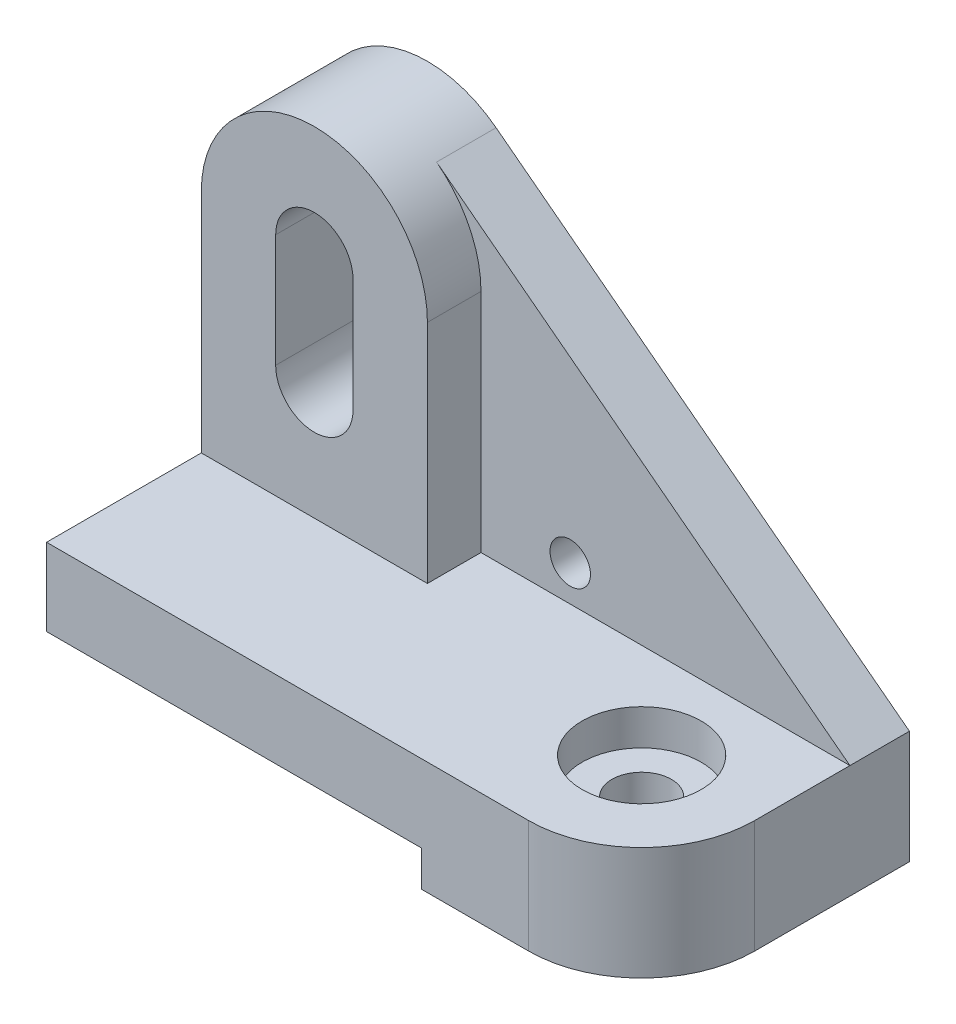
ISO-10303-21;
HEADER;
FILE_DESCRIPTION(('STEP AP214'),'2;1');
FILE_NAME('part.step','',(''),(''),'','','');
FILE_SCHEMA(('AUTOMOTIVE_DESIGN { 1 0 10303 214 1 1 1 1 }'));
ENDSEC;
DATA;
#1=APPLICATION_CONTEXT('core data for automotive mechanical design processes');
#2=APPLICATION_PROTOCOL_DEFINITION('international standard','automotive_design',2000,#1);
#3=PRODUCT_CONTEXT('',#1,'mechanical');
#4=PRODUCT('Part','Part','',(#3));
#5=PRODUCT_RELATED_PRODUCT_CATEGORY('part','',(#4));
#6=PRODUCT_DEFINITION_FORMATION('','',#4);
#7=PRODUCT_DEFINITION_CONTEXT('part definition',#1,'design');
#8=PRODUCT_DEFINITION('design','',#6,#7);
#9=PRODUCT_DEFINITION_SHAPE('','',#8);
#10=(LENGTH_UNIT() NAMED_UNIT(*) SI_UNIT(.MILLI.,.METRE.));
#11=(NAMED_UNIT(*) PLANE_ANGLE_UNIT() SI_UNIT($,.RADIAN.));
#12=(NAMED_UNIT(*) SI_UNIT($,.STERADIAN.) SOLID_ANGLE_UNIT());
#13=UNCERTAINTY_MEASURE_WITH_UNIT(LENGTH_MEASURE(1.E-05),#10,'distance_accuracy_value','');
#14=(GEOMETRIC_REPRESENTATION_CONTEXT(3) GLOBAL_UNCERTAINTY_ASSIGNED_CONTEXT((#13)) GLOBAL_UNIT_ASSIGNED_CONTEXT((#10,
#11,#12)) REPRESENTATION_CONTEXT('',''));
#15=CARTESIAN_POINT('',(0.,0.,0.));
#16=DIRECTION('',(0.,0.,1.));
#17=DIRECTION('',(1.,0.,0.));
#18=AXIS2_PLACEMENT_3D('',#15,#16,#17);
#19=CARTESIAN_POINT('',(100.,0.,45.));
#20=DIRECTION('',(0.,-1.,0.));
#21=DIRECTION('',(1.,0.,0.));
#22=AXIS2_PLACEMENT_3D('',#19,#20,#21);
#23=PLANE('',#22);
#24=CARTESIAN_POINT('',(81.,0.,26.));
#25=DIRECTION('',(0.,1.,0.));
#26=DIRECTION('',(0.,0.,1.));
#27=AXIS2_PLACEMENT_3D('',#24,#25,#26);
#28=CIRCLE('',#27,10.);
#29=CARTESIAN_POINT('',(81.,0.,36.));
#30=VERTEX_POINT('',#29);
#31=EDGE_CURVE('E353',#30,#30,#28,.T.);
#32=ORIENTED_EDGE('',*,*,#31,.F.);
#33=EDGE_LOOP('',(#32));
#34=FACE_BOUND('',#33,.T.);
#35=DIRECTION('',(-1.,0.,0.));
#36=VECTOR('',#35,1.);
#37=CARTESIAN_POINT('',(100.,0.,45.));
#38=LINE('',#37,#36);
#39=CARTESIAN_POINT('',(81.,0.,45.));
#40=VERTEX_POINT('',#39);
#41=CARTESIAN_POINT('',(0.,0.,45.));
#42=VERTEX_POINT('',#41);
#43=EDGE_CURVE('E278',#40,#42,#38,.T.);
#44=ORIENTED_EDGE('',*,*,#43,.F.);
#45=CARTESIAN_POINT('',(81.,0.,26.));
#46=DIRECTION('',(0.,-1.,0.));
#47=DIRECTION('',(1.,0.,0.));
#48=AXIS2_PLACEMENT_3D('',#45,#46,#47);
#49=CIRCLE('',#48,19.);
#50=CARTESIAN_POINT('',(100.,0.,26.));
#51=VERTEX_POINT('',#50);
#52=EDGE_CURVE('E69',#40,#51,#49,.F.);
#53=ORIENTED_EDGE('',*,*,#52,.T.);
#54=DIRECTION('',(0.,0.,-1.));
#55=VECTOR('',#54,1.);
#56=CARTESIAN_POINT('',(100.,0.,45.));
#57=LINE('',#56,#55);
#58=CARTESIAN_POINT('',(100.,0.,10.));
#59=VERTEX_POINT('',#58);
#60=EDGE_CURVE('E244',#51,#59,#57,.T.);
#61=ORIENTED_EDGE('',*,*,#60,.T.);
#62=DIRECTION('',(-1.,0.,0.));
#63=VECTOR('',#62,1.);
#64=CARTESIAN_POINT('',(0.,0.,10.));
#65=LINE('',#64,#63);
#66=CARTESIAN_POINT('',(38.,0.,10.));
#67=VERTEX_POINT('',#66);
#68=EDGE_CURVE('E215',#59,#67,#65,.T.);
#69=ORIENTED_EDGE('',*,*,#68,.T.);
#70=DIRECTION('',(0.,0.,-1.));
#71=VECTOR('',#70,1.);
#72=CARTESIAN_POINT('',(38.,0.,19.));
#73=LINE('',#72,#71);
#74=CARTESIAN_POINT('',(38.,0.,19.));
#75=VERTEX_POINT('',#74);
#76=EDGE_CURVE('E208',#75,#67,#73,.T.);
#77=ORIENTED_EDGE('',*,*,#76,.F.);
#78=DIRECTION('',(1.,0.,0.));
#79=VECTOR('',#78,1.);
#80=CARTESIAN_POINT('',(0.,0.,19.));
#81=LINE('',#80,#79);
#82=CARTESIAN_POINT('',(0.,0.,19.));
#83=VERTEX_POINT('',#82);
#84=EDGE_CURVE('E190',#83,#75,#81,.T.);
#85=ORIENTED_EDGE('',*,*,#84,.F.);
#86=DIRECTION('',(0.,0.,-1.));
#87=VECTOR('',#86,1.);
#88=CARTESIAN_POINT('',(0.,0.,45.));
#89=LINE('',#88,#87);
#90=EDGE_CURVE('E221',#42,#83,#89,.T.);
#91=ORIENTED_EDGE('',*,*,#90,.F.);
#92=EDGE_LOOP('',(#44,#53,#61,#69,#77,#85,#91));
#93=FACE_BOUND('',#92,.T.);
#94=ADVANCED_FACE('F46',(#34,#93),#23,.F.);
#95=CARTESIAN_POINT('',(19.,38.,10.));
#96=DIRECTION('',(0.,0.,-1.));
#97=DIRECTION('',(-1.,0.,0.));
#98=AXIS2_PLACEMENT_3D('',#95,#96,#97);
#99=PLANE('',#98);
#100=CARTESIAN_POINT('',(53.,6.00000000000002,10.));
#101=DIRECTION('',(0.,0.,1.));
#102=DIRECTION('',(1.,0.,0.));
#103=AXIS2_PLACEMENT_3D('',#100,#101,#102);
#104=CIRCLE('',#103,3.39999999999999);
#105=CARTESIAN_POINT('',(56.4,6.00000000000002,10.));
#106=VERTEX_POINT('',#105);
#107=EDGE_CURVE('E361',#106,#106,#104,.T.);
#108=ORIENTED_EDGE('',*,*,#107,.F.);
#109=EDGE_LOOP('',(#108));
#110=FACE_BOUND('',#109,.T.);
#111=DIRECTION('',(0.,1.,0.));
#112=VECTOR('',#111,1.);
#113=CARTESIAN_POINT('',(38.,0.,10.));
#114=LINE('',#113,#112);
#115=CARTESIAN_POINT('',(38.,38.,10.));
#116=VERTEX_POINT('',#115);
#117=EDGE_CURVE('E202',#67,#116,#114,.T.);
#118=ORIENTED_EDGE('',*,*,#117,.F.);
#119=ORIENTED_EDGE('',*,*,#68,.F.);
#120=DIRECTION('',(0.79448191507605,-0.607287812010987,0.));
#121=VECTOR('',#120,1.);
#122=CARTESIAN_POINT('',(100.,0.,10.));
#123=LINE('',#122,#121);
#124=CARTESIAN_POINT('',(30.5384684282088,53.095156386445,10.));
#125=VERTEX_POINT('',#124);
#126=EDGE_CURVE('E219',#125,#59,#123,.T.);
#127=ORIENTED_EDGE('',*,*,#126,.F.);
#128=CARTESIAN_POINT('',(19.,38.,10.));
#129=DIRECTION('',(0.,0.,1.));
#130=DIRECTION('',(1.,0.,0.));
#131=AXIS2_PLACEMENT_3D('',#128,#129,#130);
#132=CIRCLE('',#131,19.);
#133=EDGE_CURVE('E194',#116,#125,#132,.T.);
#134=ORIENTED_EDGE('',*,*,#133,.F.);
#135=EDGE_LOOP('',(#118,#119,#127,#134));
#136=FACE_BOUND('',#135,.T.);
#137=ADVANCED_FACE('F322',(#110,#136),#99,.F.);
#138=CARTESIAN_POINT('',(0.,0.,45.));
#139=DIRECTION('',(1.,0.,0.));
#140=DIRECTION('',(0.,1.,0.));
#141=AXIS2_PLACEMENT_3D('',#138,#139,#140);
#142=PLANE('',#141);
#143=DIRECTION('',(0.,-1.,0.));
#144=VECTOR('',#143,1.);
#145=CARTESIAN_POINT('',(0.,0.,0.));
#146=LINE('',#145,#144);
#147=CARTESIAN_POINT('',(0.,38.,0.));
#148=VERTEX_POINT('',#147);
#149=CARTESIAN_POINT('',(0.,-13.,0.));
#150=VERTEX_POINT('',#149);
#151=EDGE_CURVE('E225',#148,#150,#146,.T.);
#152=ORIENTED_EDGE('',*,*,#151,.T.);
#153=DIRECTION('',(0.,0.,-1.));
#154=VECTOR('',#153,1.);
#155=CARTESIAN_POINT('',(0.,-13.,45.));
#156=LINE('',#155,#154);
#157=CARTESIAN_POINT('',(0.,-13.,45.));
#158=VERTEX_POINT('',#157);
#159=EDGE_CURVE('E262',#158,#150,#156,.T.);
#160=ORIENTED_EDGE('',*,*,#159,.F.);
#161=DIRECTION('',(0.,-1.,0.));
#162=VECTOR('',#161,1.);
#163=CARTESIAN_POINT('',(0.,0.,45.));
#164=LINE('',#163,#162);
#165=EDGE_CURVE('E276',#42,#158,#164,.T.);
#166=ORIENTED_EDGE('',*,*,#165,.F.);
#167=ORIENTED_EDGE('',*,*,#90,.T.);
#168=DIRECTION('',(0.,-1.,0.));
#169=VECTOR('',#168,1.);
#170=CARTESIAN_POINT('',(0.,0.,19.));
#171=LINE('',#170,#169);
#172=CARTESIAN_POINT('',(0.,38.,19.));
#173=VERTEX_POINT('',#172);
#174=EDGE_CURVE('E199',#173,#83,#171,.T.);
#175=ORIENTED_EDGE('',*,*,#174,.F.);
#176=DIRECTION('',(0.,0.,-1.));
#177=VECTOR('',#176,1.);
#178=CARTESIAN_POINT('',(0.,38.,10.));
#179=LINE('',#178,#177);
#180=EDGE_CURVE('E231',#173,#148,#179,.T.);
#181=ORIENTED_EDGE('',*,*,#180,.T.);
#182=EDGE_LOOP('',(#152,#160,#166,#167,#175,#181));
#183=FACE_BOUND('',#182,.T.);
#184=ADVANCED_FACE('F274',(#183),#142,.F.);
#185=CARTESIAN_POINT('',(0.,-13.,45.));
#186=DIRECTION('',(0.,1.,0.));
#187=DIRECTION('',(-1.,0.,0.));
#188=AXIS2_PLACEMENT_3D('',#185,#186,#187);
#189=PLANE('',#188);
#190=DIRECTION('',(1.,0.,0.));
#191=VECTOR('',#190,1.);
#192=CARTESIAN_POINT('',(0.,-13.,0.));
#193=LINE('',#192,#191);
#194=CARTESIAN_POINT('',(63.,-13.,0.));
#195=VERTEX_POINT('',#194);
#196=EDGE_CURVE('E299',#150,#195,#193,.T.);
#197=ORIENTED_EDGE('',*,*,#196,.T.);
#198=DIRECTION('',(0.,0.,-1.));
#199=VECTOR('',#198,1.);
#200=CARTESIAN_POINT('',(63.,-13.,45.));
#201=LINE('',#200,#199);
#202=CARTESIAN_POINT('',(63.,-13.,45.));
#203=VERTEX_POINT('',#202);
#204=EDGE_CURVE('E259',#203,#195,#201,.T.);
#205=ORIENTED_EDGE('',*,*,#204,.F.);
#206=DIRECTION('',(1.,0.,0.));
#207=VECTOR('',#206,1.);
#208=CARTESIAN_POINT('',(0.,-13.,45.));
#209=LINE('',#208,#207);
#210=EDGE_CURVE('E292',#158,#203,#209,.T.);
#211=ORIENTED_EDGE('',*,*,#210,.F.);
#212=ORIENTED_EDGE('',*,*,#159,.T.);
#213=EDGE_LOOP('',(#197,#205,#211,#212));
#214=FACE_BOUND('',#213,.T.);
#215=ADVANCED_FACE('F335',(#214),#189,.F.);
#216=CARTESIAN_POINT('',(63.,-13.,45.));
#217=DIRECTION('',(1.,0.,0.));
#218=DIRECTION('',(0.,0.,-1.));
#219=AXIS2_PLACEMENT_3D('',#216,#217,#218);
#220=PLANE('',#219);
#221=DIRECTION('',(0.,-1.,0.));
#222=VECTOR('',#221,1.);
#223=CARTESIAN_POINT('',(63.,-13.,0.));
#224=LINE('',#223,#222);
#225=CARTESIAN_POINT('',(63.,-19.,0.));
#226=VERTEX_POINT('',#225);
#227=EDGE_CURVE('E301',#195,#226,#224,.T.);
#228=ORIENTED_EDGE('',*,*,#227,.T.);
#229=DIRECTION('',(0.,0.,-1.));
#230=VECTOR('',#229,1.);
#231=CARTESIAN_POINT('',(63.,-19.,45.));
#232=LINE('',#231,#230);
#233=CARTESIAN_POINT('',(63.,-19.,45.));
#234=VERTEX_POINT('',#233);
#235=EDGE_CURVE('E256',#234,#226,#232,.T.);
#236=ORIENTED_EDGE('',*,*,#235,.F.);
#237=DIRECTION('',(0.,-1.,0.));
#238=VECTOR('',#237,1.);
#239=CARTESIAN_POINT('',(63.,-13.,45.));
#240=LINE('',#239,#238);
#241=EDGE_CURVE('E294',#203,#234,#240,.T.);
#242=ORIENTED_EDGE('',*,*,#241,.F.);
#243=ORIENTED_EDGE('',*,*,#204,.T.);
#244=EDGE_LOOP('',(#228,#236,#242,#243));
#245=FACE_BOUND('',#244,.T.);
#246=ADVANCED_FACE('F334',(#245),#220,.F.);
#247=CARTESIAN_POINT('',(63.,-19.,45.));
#248=DIRECTION('',(0.,1.,0.));
#249=DIRECTION('',(0.,0.,1.));
#250=AXIS2_PLACEMENT_3D('',#247,#248,#249);
#251=PLANE('',#250);
#252=CARTESIAN_POINT('',(81.,-19.,26.));
#253=DIRECTION('',(0.,1.,0.));
#254=DIRECTION('',(0.,0.,1.));
#255=AXIS2_PLACEMENT_3D('',#252,#253,#254);
#256=CIRCLE('',#255,5.00000000000002);
#257=CARTESIAN_POINT('',(81.,-19.,31.));
#258=VERTEX_POINT('',#257);
#259=EDGE_CURVE('E366',#258,#258,#256,.T.);
#260=ORIENTED_EDGE('',*,*,#259,.T.);
#261=EDGE_LOOP('',(#260));
#262=FACE_BOUND('',#261,.T.);
#263=DIRECTION('',(0.,0.,-1.));
#264=VECTOR('',#263,1.);
#265=CARTESIAN_POINT('',(100.,-19.,45.));
#266=LINE('',#265,#264);
#267=CARTESIAN_POINT('',(100.,-19.,26.));
#268=VERTEX_POINT('',#267);
#269=CARTESIAN_POINT('',(100.,-19.,0.));
#270=VERTEX_POINT('',#269);
#271=EDGE_CURVE('E247',#268,#270,#266,.T.);
#272=ORIENTED_EDGE('',*,*,#271,.F.);
#273=CARTESIAN_POINT('',(81.,-19.,26.));
#274=DIRECTION('',(0.,1.,0.));
#275=DIRECTION('',(0.,0.,1.));
#276=AXIS2_PLACEMENT_3D('',#273,#274,#275);
#277=CIRCLE('',#276,19.);
#278=CARTESIAN_POINT('',(81.,-19.,45.));
#279=VERTEX_POINT('',#278);
#280=EDGE_CURVE('E13',#268,#279,#277,.F.);
#281=ORIENTED_EDGE('',*,*,#280,.T.);
#282=DIRECTION('',(1.,0.,0.));
#283=VECTOR('',#282,1.);
#284=CARTESIAN_POINT('',(63.,-19.,45.));
#285=LINE('',#284,#283);
#286=EDGE_CURVE('E248',#234,#279,#285,.T.);
#287=ORIENTED_EDGE('',*,*,#286,.F.);
#288=ORIENTED_EDGE('',*,*,#235,.T.);
#289=DIRECTION('',(1.,0.,0.));
#290=VECTOR('',#289,1.);
#291=CARTESIAN_POINT('',(63.,-19.,0.));
#292=LINE('',#291,#290);
#293=EDGE_CURVE('E302',#226,#270,#292,.T.);
#294=ORIENTED_EDGE('',*,*,#293,.T.);
#295=EDGE_LOOP('',(#272,#281,#287,#288,#294));
#296=FACE_BOUND('',#295,.T.);
#297=ADVANCED_FACE('F327',(#262,#296),#251,.F.);
#298=CARTESIAN_POINT('',(100.,-19.,45.));
#299=DIRECTION('',(-1.,0.,0.));
#300=DIRECTION('',(0.,0.,1.));
#301=AXIS2_PLACEMENT_3D('',#298,#299,#300);
#302=PLANE('',#301);
#303=ORIENTED_EDGE('',*,*,#60,.F.);
#304=DIRECTION('',(0.,1.,0.));
#305=VECTOR('',#304,1.);
#306=CARTESIAN_POINT('',(100.,-19.,26.));
#307=LINE('',#306,#305);
#308=EDGE_CURVE('E55',#51,#268,#307,.F.);
#309=ORIENTED_EDGE('',*,*,#308,.T.);
#310=ORIENTED_EDGE('',*,*,#271,.T.);
#311=DIRECTION('',(0.,1.,0.));
#312=VECTOR('',#311,1.);
#313=CARTESIAN_POINT('',(100.,-19.,0.));
#314=LINE('',#313,#312);
#315=CARTESIAN_POINT('',(100.,0.,0.));
#316=VERTEX_POINT('',#315);
#317=EDGE_CURVE('E253',#270,#316,#314,.T.);
#318=ORIENTED_EDGE('',*,*,#317,.T.);
#319=DIRECTION('',(0.,0.,-1.));
#320=VECTOR('',#319,1.);
#321=CARTESIAN_POINT('',(100.,0.,10.));
#322=LINE('',#321,#320);
#323=EDGE_CURVE('E223',#59,#316,#322,.T.);
#324=ORIENTED_EDGE('',*,*,#323,.F.);
#325=EDGE_LOOP('',(#303,#309,#310,#318,#324));
#326=FACE_BOUND('',#325,.T.);
#327=ADVANCED_FACE('F309',(#326),#302,.F.);
#328=CARTESIAN_POINT('',(0.,0.,45.));
#329=DIRECTION('',(0.,0.,1.));
#330=DIRECTION('',(1.,0.,0.));
#331=AXIS2_PLACEMENT_3D('',#328,#329,#330);
#332=PLANE('',#331);
#333=ORIENTED_EDGE('',*,*,#286,.T.);
#334=DIRECTION('',(0.,1.,0.));
#335=VECTOR('',#334,1.);
#336=CARTESIAN_POINT('',(81.,0.,45.));
#337=LINE('',#336,#335);
#338=EDGE_CURVE('E241',#279,#40,#337,.T.);
#339=ORIENTED_EDGE('',*,*,#338,.T.);
#340=ORIENTED_EDGE('',*,*,#43,.T.);
#341=ORIENTED_EDGE('',*,*,#165,.T.);
#342=ORIENTED_EDGE('',*,*,#210,.T.);
#343=ORIENTED_EDGE('',*,*,#241,.T.);
#344=EDGE_LOOP('',(#333,#339,#340,#341,#342,#343));
#345=FACE_BOUND('',#344,.T.);
#346=ADVANCED_FACE('F329',(#345),#332,.T.);
#347=CARTESIAN_POINT('',(0.,0.,0.));
#348=DIRECTION('',(0.,0.,1.));
#349=DIRECTION('',(1.,0.,0.));
#350=AXIS2_PLACEMENT_3D('',#347,#348,#349);
#351=PLANE('',#350);
#352=CARTESIAN_POINT('',(53.,6.00000000000002,0.));
#353=DIRECTION('',(0.,0.,1.));
#354=DIRECTION('',(1.,0.,0.));
#355=AXIS2_PLACEMENT_3D('',#352,#353,#354);
#356=CIRCLE('',#355,3.39999999999999);
#357=CARTESIAN_POINT('',(56.4,6.00000000000002,0.));
#358=VERTEX_POINT('',#357);
#359=EDGE_CURVE('E50',#358,#358,#356,.T.);
#360=ORIENTED_EDGE('',*,*,#359,.T.);
#361=EDGE_LOOP('',(#360));
#362=FACE_BOUND('',#361,.T.);
#363=DIRECTION('',(0.,1.,0.));
#364=VECTOR('',#363,1.);
#365=CARTESIAN_POINT('',(25.5,0.,0.));
#366=LINE('',#365,#364);
#367=CARTESIAN_POINT('',(25.5,19.,0.));
#368=VERTEX_POINT('',#367);
#369=CARTESIAN_POINT('',(25.5,38.,0.));
#370=VERTEX_POINT('',#369);
#371=EDGE_CURVE('E236',#368,#370,#366,.T.);
#372=ORIENTED_EDGE('',*,*,#371,.T.);
#373=CARTESIAN_POINT('',(19.,38.,0.));
#374=DIRECTION('',(0.,0.,1.));
#375=DIRECTION('',(1.,0.,0.));
#376=AXIS2_PLACEMENT_3D('',#373,#374,#375);
#377=CIRCLE('',#376,6.5);
#378=CARTESIAN_POINT('',(12.5,38.,0.));
#379=VERTEX_POINT('',#378);
#380=EDGE_CURVE('E204',#370,#379,#377,.T.);
#381=ORIENTED_EDGE('',*,*,#380,.T.);
#382=DIRECTION('',(0.,1.,0.));
#383=VECTOR('',#382,1.);
#384=CARTESIAN_POINT('',(12.5,0.,0.));
#385=LINE('',#384,#383);
#386=CARTESIAN_POINT('',(12.5,19.,0.));
#387=VERTEX_POINT('',#386);
#388=EDGE_CURVE('E189',#379,#387,#385,.F.);
#389=ORIENTED_EDGE('',*,*,#388,.T.);
#390=CARTESIAN_POINT('',(19.,19.,0.));
#391=DIRECTION('',(0.,0.,1.));
#392=DIRECTION('',(1.,0.,0.));
#393=AXIS2_PLACEMENT_3D('',#390,#391,#392);
#394=CIRCLE('',#393,6.5);
#395=EDGE_CURVE('E162',#387,#368,#394,.T.);
#396=ORIENTED_EDGE('',*,*,#395,.T.);
#397=EDGE_LOOP('',(#372,#381,#389,#396));
#398=FACE_BOUND('',#397,.T.);
#399=ORIENTED_EDGE('',*,*,#151,.F.);
#400=CARTESIAN_POINT('',(19.,38.,0.));
#401=DIRECTION('',(0.,0.,-1.));
#402=DIRECTION('',(-1.,0.,0.));
#403=AXIS2_PLACEMENT_3D('',#400,#401,#402);
#404=CIRCLE('',#403,19.);
#405=CARTESIAN_POINT('',(30.5384684282088,53.095156386445,0.));
#406=VERTEX_POINT('',#405);
#407=EDGE_CURVE('E210',#148,#406,#404,.T.);
#408=ORIENTED_EDGE('',*,*,#407,.T.);
#409=DIRECTION('',(0.79448191507605,-0.607287812010987,0.));
#410=VECTOR('',#409,1.);
#411=CARTESIAN_POINT('',(100.,0.,0.));
#412=LINE('',#411,#410);
#413=EDGE_CURVE('E220',#406,#316,#412,.T.);
#414=ORIENTED_EDGE('',*,*,#413,.T.);
#415=ORIENTED_EDGE('',*,*,#317,.F.);
#416=ORIENTED_EDGE('',*,*,#293,.F.);
#417=ORIENTED_EDGE('',*,*,#227,.F.);
#418=ORIENTED_EDGE('',*,*,#196,.F.);
#419=EDGE_LOOP('',(#399,#408,#414,#415,#416,#417,#418));
#420=FACE_BOUND('',#419,.T.);
#421=ADVANCED_FACE('F312',(#362,#398,#420),#351,.F.);
#422=CARTESIAN_POINT('',(100.,0.,10.));
#423=DIRECTION('',(0.607287812010987,0.79448191507605,0.));
#424=DIRECTION('',(-0.79448191507605,0.607287812010987,0.));
#425=AXIS2_PLACEMENT_3D('',#422,#423,#424);
#426=PLANE('',#425);
#427=ORIENTED_EDGE('',*,*,#413,.F.);
#428=DIRECTION('',(0.,0.,-1.));
#429=VECTOR('',#428,1.);
#430=CARTESIAN_POINT('',(30.5384684282088,53.095156386445,10.));
#431=LINE('',#430,#429);
#432=EDGE_CURVE('E226',#125,#406,#431,.T.);
#433=ORIENTED_EDGE('',*,*,#432,.F.);
#434=ORIENTED_EDGE('',*,*,#126,.T.);
#435=ORIENTED_EDGE('',*,*,#323,.T.);
#436=EDGE_LOOP('',(#427,#433,#434,#435));
#437=FACE_BOUND('',#436,.T.);
#438=ADVANCED_FACE('F317',(#437),#426,.T.);
#439=CARTESIAN_POINT('',(19.,38.,10.));
#440=DIRECTION('',(0.,0.,-1.));
#441=DIRECTION('',(-1.,0.,0.));
#442=AXIS2_PLACEMENT_3D('',#439,#440,#441);
#443=CYLINDRICAL_SURFACE('',#442,19.);
#444=ORIENTED_EDGE('',*,*,#407,.F.);
#445=ORIENTED_EDGE('',*,*,#180,.F.);
#446=CARTESIAN_POINT('',(19.,38.,19.));
#447=DIRECTION('',(0.,0.,1.));
#448=DIRECTION('',(1.,0.,0.));
#449=AXIS2_PLACEMENT_3D('',#446,#447,#448);
#450=CIRCLE('',#449,19.);
#451=CARTESIAN_POINT('',(38.,38.,19.));
#452=VERTEX_POINT('',#451);
#453=EDGE_CURVE('E196',#452,#173,#450,.T.);
#454=ORIENTED_EDGE('',*,*,#453,.F.);
#455=DIRECTION('',(0.,0.,-1.));
#456=VECTOR('',#455,1.);
#457=CARTESIAN_POINT('',(38.,38.,19.));
#458=LINE('',#457,#456);
#459=EDGE_CURVE('E201',#452,#116,#458,.T.);
#460=ORIENTED_EDGE('',*,*,#459,.T.);
#461=ORIENTED_EDGE('',*,*,#133,.T.);
#462=ORIENTED_EDGE('',*,*,#432,.T.);
#463=EDGE_LOOP('',(#444,#445,#454,#460,#461,#462));
#464=FACE_BOUND('',#463,.T.);
#465=ADVANCED_FACE('F284',(#464),#443,.T.);
#466=CARTESIAN_POINT('',(38.,0.,19.));
#467=DIRECTION('',(-1.,0.,0.));
#468=DIRECTION('',(0.,0.,1.));
#469=AXIS2_PLACEMENT_3D('',#466,#467,#468);
#470=PLANE('',#469);
#471=ORIENTED_EDGE('',*,*,#117,.T.);
#472=ORIENTED_EDGE('',*,*,#459,.F.);
#473=DIRECTION('',(0.,1.,0.));
#474=VECTOR('',#473,1.);
#475=CARTESIAN_POINT('',(38.,0.,19.));
#476=LINE('',#475,#474);
#477=EDGE_CURVE('E193',#75,#452,#476,.T.);
#478=ORIENTED_EDGE('',*,*,#477,.F.);
#479=ORIENTED_EDGE('',*,*,#76,.T.);
#480=EDGE_LOOP('',(#471,#472,#478,#479));
#481=FACE_BOUND('',#480,.T.);
#482=ADVANCED_FACE('F426',(#481),#470,.F.);
#483=CARTESIAN_POINT('',(19.,38.,19.));
#484=DIRECTION('',(0.,0.,1.));
#485=DIRECTION('',(1.,0.,0.));
#486=AXIS2_PLACEMENT_3D('',#483,#484,#485);
#487=PLANE('',#486);
#488=CARTESIAN_POINT('',(19.,38.,19.));
#489=DIRECTION('',(0.,0.,1.));
#490=DIRECTION('',(1.,0.,0.));
#491=AXIS2_PLACEMENT_3D('',#488,#489,#490);
#492=CIRCLE('',#491,6.5);
#493=CARTESIAN_POINT('',(25.5,38.,19.));
#494=VERTEX_POINT('',#493);
#495=CARTESIAN_POINT('',(12.5,38.,19.));
#496=VERTEX_POINT('',#495);
#497=EDGE_CURVE('E175',#494,#496,#492,.T.);
#498=ORIENTED_EDGE('',*,*,#497,.F.);
#499=DIRECTION('',(0.,1.,0.));
#500=VECTOR('',#499,1.);
#501=CARTESIAN_POINT('',(25.5,38.,19.));
#502=LINE('',#501,#500);
#503=CARTESIAN_POINT('',(25.5,19.,19.));
#504=VERTEX_POINT('',#503);
#505=EDGE_CURVE('E180',#504,#494,#502,.T.);
#506=ORIENTED_EDGE('',*,*,#505,.F.);
#507=CARTESIAN_POINT('',(19.,19.,19.));
#508=DIRECTION('',(0.,0.,1.));
#509=DIRECTION('',(1.,0.,0.));
#510=AXIS2_PLACEMENT_3D('',#507,#508,#509);
#511=CIRCLE('',#510,6.5);
#512=CARTESIAN_POINT('',(12.5,19.,19.));
#513=VERTEX_POINT('',#512);
#514=EDGE_CURVE('E159',#513,#504,#511,.T.);
#515=ORIENTED_EDGE('',*,*,#514,.F.);
#516=DIRECTION('',(0.,-1.,0.));
#517=VECTOR('',#516,1.);
#518=CARTESIAN_POINT('',(12.5,38.,19.));
#519=LINE('',#518,#517);
#520=EDGE_CURVE('E171',#496,#513,#519,.T.);
#521=ORIENTED_EDGE('',*,*,#520,.F.);
#522=EDGE_LOOP('',(#498,#506,#515,#521));
#523=FACE_BOUND('',#522,.T.);
#524=ORIENTED_EDGE('',*,*,#84,.T.);
#525=ORIENTED_EDGE('',*,*,#477,.T.);
#526=ORIENTED_EDGE('',*,*,#453,.T.);
#527=ORIENTED_EDGE('',*,*,#174,.T.);
#528=EDGE_LOOP('',(#524,#525,#526,#527));
#529=FACE_BOUND('',#528,.T.);
#530=ADVANCED_FACE('F177',(#523,#529),#487,.T.);
#531=CARTESIAN_POINT('',(19.,38.,-2.50000000007189E-05));
#532=DIRECTION('',(0.,0.,1.));
#533=DIRECTION('',(1.,0.,0.));
#534=AXIS2_PLACEMENT_3D('',#531,#532,#533);
#535=CYLINDRICAL_SURFACE('',#534,6.5);
#536=DIRECTION('',(0.,0.,1.));
#537=VECTOR('',#536,1.);
#538=CARTESIAN_POINT('',(25.5,38.,-2.50000000007189E-05));
#539=LINE('',#538,#537);
#540=EDGE_CURVE('E187',#370,#494,#539,.T.);
#541=ORIENTED_EDGE('',*,*,#540,.T.);
#542=ORIENTED_EDGE('',*,*,#497,.T.);
#543=DIRECTION('',(0.,0.,1.));
#544=VECTOR('',#543,1.);
#545=CARTESIAN_POINT('',(12.5,38.,-2.50000000007189E-05));
#546=LINE('',#545,#544);
#547=EDGE_CURVE('E167',#379,#496,#546,.T.);
#548=ORIENTED_EDGE('',*,*,#547,.F.);
#549=ORIENTED_EDGE('',*,*,#380,.F.);
#550=EDGE_LOOP('',(#541,#542,#548,#549));
#551=FACE_BOUND('',#550,.T.);
#552=ADVANCED_FACE('F369',(#551),#535,.F.);
#553=CARTESIAN_POINT('',(25.5,38.,-2.50000000007189E-05));
#554=DIRECTION('',(1.,0.,0.));
#555=DIRECTION('',(0.,1.,0.));
#556=AXIS2_PLACEMENT_3D('',#553,#554,#555);
#557=PLANE('',#556);
#558=DIRECTION('',(0.,0.,1.));
#559=VECTOR('',#558,1.);
#560=CARTESIAN_POINT('',(25.5,19.,-2.50000000007189E-05));
#561=LINE('',#560,#559);
#562=EDGE_CURVE('E166',#368,#504,#561,.T.);
#563=ORIENTED_EDGE('',*,*,#562,.T.);
#564=ORIENTED_EDGE('',*,*,#505,.T.);
#565=ORIENTED_EDGE('',*,*,#540,.F.);
#566=ORIENTED_EDGE('',*,*,#371,.F.);
#567=EDGE_LOOP('',(#563,#564,#565,#566));
#568=FACE_BOUND('',#567,.T.);
#569=ADVANCED_FACE('F373',(#568),#557,.F.);
#570=CARTESIAN_POINT('',(19.,19.,-2.50000000007189E-05));
#571=DIRECTION('',(0.,0.,1.));
#572=DIRECTION('',(1.,0.,0.));
#573=AXIS2_PLACEMENT_3D('',#570,#571,#572);
#574=CYLINDRICAL_SURFACE('',#573,6.5);
#575=DIRECTION('',(0.,0.,1.));
#576=VECTOR('',#575,1.);
#577=CARTESIAN_POINT('',(12.5,19.,-2.50000000007189E-05));
#578=LINE('',#577,#576);
#579=EDGE_CURVE('E155',#387,#513,#578,.T.);
#580=ORIENTED_EDGE('',*,*,#579,.T.);
#581=ORIENTED_EDGE('',*,*,#514,.T.);
#582=ORIENTED_EDGE('',*,*,#562,.F.);
#583=ORIENTED_EDGE('',*,*,#395,.F.);
#584=EDGE_LOOP('',(#580,#581,#582,#583));
#585=FACE_BOUND('',#584,.T.);
#586=ADVANCED_FACE('F157',(#585),#574,.F.);
#587=CARTESIAN_POINT('',(12.5,38.,-2.50000000007189E-05));
#588=DIRECTION('',(-1.,0.,0.));
#589=DIRECTION('',(0.,-1.,0.));
#590=AXIS2_PLACEMENT_3D('',#587,#588,#589);
#591=PLANE('',#590);
#592=ORIENTED_EDGE('',*,*,#547,.T.);
#593=ORIENTED_EDGE('',*,*,#520,.T.);
#594=ORIENTED_EDGE('',*,*,#579,.F.);
#595=ORIENTED_EDGE('',*,*,#388,.F.);
#596=EDGE_LOOP('',(#592,#593,#594,#595));
#597=FACE_BOUND('',#596,.T.);
#598=ADVANCED_FACE('F172',(#597),#591,.F.);
#599=CARTESIAN_POINT('',(81.,0.,26.));
#600=DIRECTION('',(0.,-1.,0.));
#601=DIRECTION('',(0.,0.,-1.));
#602=AXIS2_PLACEMENT_3D('',#599,#600,#601);
#603=CYLINDRICAL_SURFACE('',#602,19.);
#604=ORIENTED_EDGE('',*,*,#280,.F.);
#605=ORIENTED_EDGE('',*,*,#308,.F.);
#606=ORIENTED_EDGE('',*,*,#52,.F.);
#607=ORIENTED_EDGE('',*,*,#338,.F.);
#608=EDGE_LOOP('',(#604,#605,#606,#607));
#609=FACE_BOUND('',#608,.T.);
#610=ADVANCED_FACE('F48',(#609),#603,.T.);
#611=CARTESIAN_POINT('',(81.,0.,26.));
#612=DIRECTION('',(0.,1.,0.));
#613=DIRECTION('',(0.,0.,1.));
#614=AXIS2_PLACEMENT_3D('',#611,#612,#613);
#615=CYLINDRICAL_SURFACE('',#614,5.00000000000002);
#616=ORIENTED_EDGE('',*,*,#259,.F.);
#617=EDGE_LOOP('',(#616));
#618=FACE_BOUND('',#617,.T.);
#619=CARTESIAN_POINT('',(81.,-5.99999999999999,26.));
#620=DIRECTION('',(0.,1.,0.));
#621=DIRECTION('',(0.,0.,1.));
#622=AXIS2_PLACEMENT_3D('',#619,#620,#621);
#623=CIRCLE('',#622,5.00000000000002);
#624=CARTESIAN_POINT('',(81.,-5.99999999999999,31.));
#625=VERTEX_POINT('',#624);
#626=EDGE_CURVE('E358',#625,#625,#623,.T.);
#627=ORIENTED_EDGE('',*,*,#626,.T.);
#628=EDGE_LOOP('',(#627));
#629=FACE_BOUND('',#628,.T.);
#630=ADVANCED_FACE('F394',(#618,#629),#615,.F.);
#631=CARTESIAN_POINT('',(86.,-5.99999999999999,26.));
#632=DIRECTION('',(0.,-1.,0.));
#633=DIRECTION('',(0.,0.,-1.));
#634=AXIS2_PLACEMENT_3D('',#631,#632,#633);
#635=PLANE('',#634);
#636=ORIENTED_EDGE('',*,*,#626,.F.);
#637=EDGE_LOOP('',(#636));
#638=FACE_BOUND('',#637,.T.);
#639=CARTESIAN_POINT('',(81.,-5.99999999999999,26.));
#640=DIRECTION('',(0.,1.,0.));
#641=DIRECTION('',(0.,0.,1.));
#642=AXIS2_PLACEMENT_3D('',#639,#640,#641);
#643=CIRCLE('',#642,10.);
#644=CARTESIAN_POINT('',(81.,-5.99999999999999,36.));
#645=VERTEX_POINT('',#644);
#646=EDGE_CURVE('E355',#645,#645,#643,.T.);
#647=ORIENTED_EDGE('',*,*,#646,.T.);
#648=EDGE_LOOP('',(#647));
#649=FACE_BOUND('',#648,.T.);
#650=ADVANCED_FACE('F397',(#638,#649),#635,.F.);
#651=CARTESIAN_POINT('',(81.,0.,26.));
#652=DIRECTION('',(0.,1.,0.));
#653=DIRECTION('',(0.,0.,1.));
#654=AXIS2_PLACEMENT_3D('',#651,#652,#653);
#655=CYLINDRICAL_SURFACE('',#654,10.);
#656=ORIENTED_EDGE('',*,*,#646,.F.);
#657=EDGE_LOOP('',(#656));
#658=FACE_BOUND('',#657,.T.);
#659=ORIENTED_EDGE('',*,*,#31,.T.);
#660=EDGE_LOOP('',(#659));
#661=FACE_BOUND('',#660,.T.);
#662=ADVANCED_FACE('F403',(#658,#661),#655,.F.);
#663=CARTESIAN_POINT('',(53.,6.00000000000002,10.));
#664=DIRECTION('',(0.,0.,1.));
#665=DIRECTION('',(1.,0.,0.));
#666=AXIS2_PLACEMENT_3D('',#663,#664,#665);
#667=CYLINDRICAL_SURFACE('',#666,3.39999999999999);
#668=ORIENTED_EDGE('',*,*,#107,.T.);
#669=EDGE_LOOP('',(#668));
#670=FACE_BOUND('',#669,.T.);
#671=ORIENTED_EDGE('',*,*,#359,.F.);
#672=EDGE_LOOP('',(#671));
#673=FACE_BOUND('',#672,.T.);
#674=ADVANCED_FACE('F408',(#670,#673),#667,.F.);
#675=CLOSED_SHELL('',(#94,#137,#184,#215,#246,#297,#327,#346,#421,#438,#465,#482,#530,#552,#569,
#586,#598,#610,#630,#650,#662,#674));
#676=MANIFOLD_SOLID_BREP('B2',#675);
#677=ADVANCED_BREP_SHAPE_REPRESENTATION('',(#18,#676),#14);
#678=SHAPE_DEFINITION_REPRESENTATION(#9,#677);
ENDSEC;
END-ISO-10303-21;
